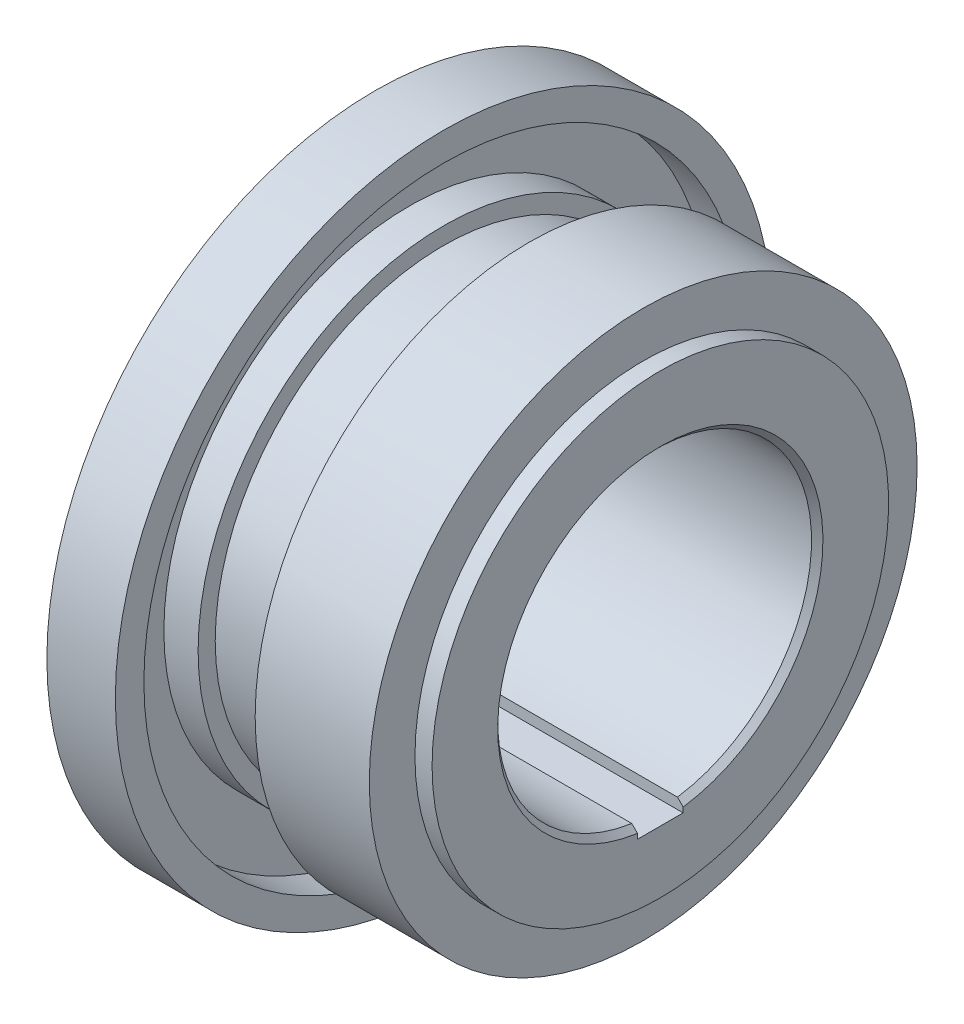
ISO-10303-21;
HEADER;
FILE_DESCRIPTION(('STEP AP214'),'2;1');
FILE_NAME('part.step','',(''),(''),'','','');
FILE_SCHEMA(('AUTOMOTIVE_DESIGN { 1 0 10303 214 1 1 1 1 }'));
ENDSEC;
DATA;
#1=APPLICATION_CONTEXT('core data for automotive mechanical design processes');
#2=APPLICATION_PROTOCOL_DEFINITION('international standard','automotive_design',2000,#1);
#3=PRODUCT_CONTEXT('',#1,'mechanical');
#4=PRODUCT('Part','Part','',(#3));
#5=PRODUCT_RELATED_PRODUCT_CATEGORY('part','',(#4));
#6=PRODUCT_DEFINITION_FORMATION('','',#4);
#7=PRODUCT_DEFINITION_CONTEXT('part definition',#1,'design');
#8=PRODUCT_DEFINITION('design','',#6,#7);
#9=PRODUCT_DEFINITION_SHAPE('','',#8);
#10=(LENGTH_UNIT() NAMED_UNIT(*) SI_UNIT(.MILLI.,.METRE.));
#11=(NAMED_UNIT(*) PLANE_ANGLE_UNIT() SI_UNIT($,.RADIAN.));
#12=(NAMED_UNIT(*) SI_UNIT($,.STERADIAN.) SOLID_ANGLE_UNIT());
#13=UNCERTAINTY_MEASURE_WITH_UNIT(LENGTH_MEASURE(1.E-05),#10,'distance_accuracy_value','');
#14=(GEOMETRIC_REPRESENTATION_CONTEXT(3) GLOBAL_UNCERTAINTY_ASSIGNED_CONTEXT((#13)) GLOBAL_UNIT_ASSIGNED_CONTEXT((#10,
#11,#12)) REPRESENTATION_CONTEXT('',''));
#15=CARTESIAN_POINT('',(0.,0.,0.));
#16=DIRECTION('',(0.,0.,1.));
#17=DIRECTION('',(1.,0.,0.));
#18=AXIS2_PLACEMENT_3D('',#15,#16,#17);
#19=CARTESIAN_POINT('',(0.,0.,0.));
#20=DIRECTION('',(-1.,0.,0.));
#21=DIRECTION('',(0.,0.,1.));
#22=AXIS2_PLACEMENT_3D('',#19,#20,#21);
#23=CYLINDRICAL_SURFACE('',#22,40.);
#24=CARTESIAN_POINT('',(50.,0.,0.));
#25=DIRECTION('',(-1.,0.,0.));
#26=DIRECTION('',(0.,0.,1.));
#27=AXIS2_PLACEMENT_3D('',#24,#25,#26);
#28=CIRCLE('',#27,40.);
#29=CARTESIAN_POINT('',(50.,0.,40.));
#30=VERTEX_POINT('',#29);
#31=EDGE_CURVE('E225',#30,#30,#28,.T.);
#32=ORIENTED_EDGE('',*,*,#31,.T.);
#33=EDGE_LOOP('',(#32));
#34=FACE_BOUND('',#33,.T.);
#35=CARTESIAN_POINT('',(47.,0.,0.));
#36=DIRECTION('',(-1.,0.,0.));
#37=DIRECTION('',(0.,-1.,0.));
#38=AXIS2_PLACEMENT_3D('',#35,#36,#37);
#39=CIRCLE('',#38,40.);
#40=CARTESIAN_POINT('',(47.,-40.,0.));
#41=VERTEX_POINT('',#40);
#42=EDGE_CURVE('E175',#41,#41,#39,.T.);
#43=ORIENTED_EDGE('',*,*,#42,.F.);
#44=EDGE_LOOP('',(#43));
#45=FACE_BOUND('',#44,.T.);
#46=ADVANCED_FACE('F46',(#34,#45),#23,.T.);
#47=CARTESIAN_POINT('',(12.,0.,0.));
#48=DIRECTION('',(-1.,0.,0.));
#49=DIRECTION('',(0.,0.,1.));
#50=AXIS2_PLACEMENT_3D('',#47,#48,#49);
#51=CIRCLE('',#50,40.);
#52=CARTESIAN_POINT('',(12.,0.,40.));
#53=VERTEX_POINT('',#52);
#54=EDGE_CURVE('E221',#53,#53,#51,.T.);
#55=ORIENTED_EDGE('',*,*,#54,.F.);
#56=EDGE_LOOP('',(#55));
#57=FACE_BOUND('',#56,.T.);
#58=CARTESIAN_POINT('',(27.,0.,0.));
#59=DIRECTION('',(1.,0.,0.));
#60=DIRECTION('',(0.,1.,0.));
#61=AXIS2_PLACEMENT_3D('',#58,#59,#60);
#62=CIRCLE('',#61,40.);
#63=CARTESIAN_POINT('',(27.,40.,0.));
#64=VERTEX_POINT('',#63);
#65=EDGE_CURVE('E179',#64,#64,#62,.T.);
#66=ORIENTED_EDGE('',*,*,#65,.F.);
#67=EDGE_LOOP('',(#66));
#68=FACE_BOUND('',#67,.T.);
#69=ADVANCED_FACE('F266',(#57,#68),#23,.T.);
#70=CARTESIAN_POINT('',(0.,0.,0.));
#71=DIRECTION('',(-1.,0.,0.));
#72=DIRECTION('',(0.,0.,1.));
#73=AXIS2_PLACEMENT_3D('',#70,#71,#72);
#74=CYLINDRICAL_SURFACE('',#73,27.5);
#75=CARTESIAN_POINT('',(49.,0.,0.));
#76=DIRECTION('',(-1.,0.,0.));
#77=DIRECTION('',(0.,0.,1.));
#78=AXIS2_PLACEMENT_3D('',#75,#76,#77);
#79=CIRCLE('',#78,27.5);
#80=CARTESIAN_POINT('',(49.,-27.2075357208256,-3.99999999999999));
#81=VERTEX_POINT('',#80);
#82=CARTESIAN_POINT('',(49.,-27.2075357208256,4.00000000000001));
#83=VERTEX_POINT('',#82);
#84=EDGE_CURVE('E193',#81,#83,#79,.F.);
#85=ORIENTED_EDGE('',*,*,#84,.T.);
#86=DIRECTION('',(-1.,0.,0.));
#87=VECTOR('',#86,1.);
#88=CARTESIAN_POINT('',(0.,-27.2075357208256,4.00000000000001));
#89=LINE('',#88,#87);
#90=CARTESIAN_POINT('',(1.00000000000002,-27.2075357208256,4.00000000000001));
#91=VERTEX_POINT('',#90);
#92=EDGE_CURVE('E156',#83,#91,#89,.T.);
#93=ORIENTED_EDGE('',*,*,#92,.T.);
#94=CARTESIAN_POINT('',(1.00000000000002,0.,0.));
#95=DIRECTION('',(1.,0.,0.));
#96=DIRECTION('',(0.,0.,-1.));
#97=AXIS2_PLACEMENT_3D('',#94,#95,#96);
#98=CIRCLE('',#97,27.5);
#99=CARTESIAN_POINT('',(1.00000000000002,-27.2075357208256,-3.99999999999999));
#100=VERTEX_POINT('',#99);
#101=EDGE_CURVE('E189',#91,#100,#98,.F.);
#102=ORIENTED_EDGE('',*,*,#101,.T.);
#103=DIRECTION('',(-1.,0.,0.));
#104=VECTOR('',#103,1.);
#105=CARTESIAN_POINT('',(0.,-27.2075357208256,-3.99999999999999));
#106=LINE('',#105,#104);
#107=EDGE_CURVE('E143',#100,#81,#106,.F.);
#108=ORIENTED_EDGE('',*,*,#107,.T.);
#109=EDGE_LOOP('',(#85,#93,#102,#108));
#110=FACE_BOUND('',#109,.T.);
#111=ADVANCED_FACE('F244',(#110),#74,.F.);
#112=CARTESIAN_POINT('',(0.,27.5,0.));
#113=DIRECTION('',(1.,0.,0.));
#114=DIRECTION('',(0.,0.,-1.));
#115=AXIS2_PLACEMENT_3D('',#112,#113,#114);
#116=PLANE('',#115);
#117=CARTESIAN_POINT('',(0.,0.,0.));
#118=DIRECTION('',(1.,0.,0.));
#119=DIRECTION('',(0.,0.,-1.));
#120=AXIS2_PLACEMENT_3D('',#117,#118,#119);
#121=CIRCLE('',#120,28.5);
#122=CARTESIAN_POINT('',(0.,-28.217902119045,-3.99999999999999));
#123=VERTEX_POINT('',#122);
#124=CARTESIAN_POINT('',(0.,-28.217902119045,4.00000000000001));
#125=VERTEX_POINT('',#124);
#126=EDGE_CURVE('E185',#123,#125,#121,.T.);
#127=ORIENTED_EDGE('',*,*,#126,.T.);
#128=DIRECTION('',(0.,1.,0.));
#129=VECTOR('',#128,1.);
#130=CARTESIAN_POINT('',(0.,-29.1,4.00000000000001));
#131=LINE('',#130,#129);
#132=CARTESIAN_POINT('',(0.,-29.1,4.00000000000001));
#133=VERTEX_POINT('',#132);
#134=EDGE_CURVE('E135',#133,#125,#131,.T.);
#135=ORIENTED_EDGE('',*,*,#134,.F.);
#136=DIRECTION('',(0.,0.,1.));
#137=VECTOR('',#136,1.);
#138=CARTESIAN_POINT('',(0.,-29.1,-3.99999999999999));
#139=LINE('',#138,#137);
#140=CARTESIAN_POINT('',(0.,-29.1,-3.99999999999999));
#141=VERTEX_POINT('',#140);
#142=EDGE_CURVE('E132',#141,#133,#139,.T.);
#143=ORIENTED_EDGE('',*,*,#142,.F.);
#144=DIRECTION('',(0.,-1.,0.));
#145=VECTOR('',#144,1.);
#146=CARTESIAN_POINT('',(0.,-29.1,-3.99999999999999));
#147=LINE('',#146,#145);
#148=EDGE_CURVE('E108',#123,#141,#147,.T.);
#149=ORIENTED_EDGE('',*,*,#148,.F.);
#150=EDGE_LOOP('',(#127,#135,#143,#149));
#151=FACE_BOUND('',#150,.T.);
#152=CARTESIAN_POINT('',(0.,0.,0.));
#153=DIRECTION('',(-1.,0.,0.));
#154=DIRECTION('',(0.,0.,1.));
#155=AXIS2_PLACEMENT_3D('',#152,#153,#154);
#156=CIRCLE('',#155,57.5);
#157=CARTESIAN_POINT('',(0.,0.,57.5));
#158=VERTEX_POINT('',#157);
#159=EDGE_CURVE('E197',#158,#158,#156,.T.);
#160=ORIENTED_EDGE('',*,*,#159,.T.);
#161=EDGE_LOOP('',(#160));
#162=FACE_BOUND('',#161,.T.);
#163=ADVANCED_FACE('F251',(#151,#162),#116,.F.);
#164=CARTESIAN_POINT('',(0.,0.,0.));
#165=DIRECTION('',(-1.,0.,0.));
#166=DIRECTION('',(0.,0.,1.));
#167=AXIS2_PLACEMENT_3D('',#164,#165,#166);
#168=CYLINDRICAL_SURFACE('',#167,57.5);
#169=ORIENTED_EDGE('',*,*,#159,.F.);
#170=EDGE_LOOP('',(#169));
#171=FACE_BOUND('',#170,.T.);
#172=CARTESIAN_POINT('',(12.,0.,0.));
#173=DIRECTION('',(-1.,0.,0.));
#174=DIRECTION('',(0.,0.,1.));
#175=AXIS2_PLACEMENT_3D('',#172,#173,#174);
#176=CIRCLE('',#175,57.5);
#177=CARTESIAN_POINT('',(12.,0.,57.5));
#178=VERTEX_POINT('',#177);
#179=EDGE_CURVE('E201',#178,#178,#176,.T.);
#180=ORIENTED_EDGE('',*,*,#179,.T.);
#181=EDGE_LOOP('',(#180));
#182=FACE_BOUND('',#181,.T.);
#183=ADVANCED_FACE('F295',(#171,#182),#168,.T.);
#184=CARTESIAN_POINT('',(12.,57.5,0.));
#185=DIRECTION('',(-1.,0.,0.));
#186=DIRECTION('',(0.,0.,1.));
#187=AXIS2_PLACEMENT_3D('',#184,#185,#186);
#188=PLANE('',#187);
#189=ORIENTED_EDGE('',*,*,#179,.F.);
#190=EDGE_LOOP('',(#189));
#191=FACE_BOUND('',#190,.T.);
#192=CARTESIAN_POINT('',(12.,0.,0.));
#193=DIRECTION('',(-1.,0.,0.));
#194=DIRECTION('',(0.,0.,1.));
#195=AXIS2_PLACEMENT_3D('',#192,#193,#194);
#196=CIRCLE('',#195,52.5);
#197=CARTESIAN_POINT('',(12.,0.,52.5));
#198=VERTEX_POINT('',#197);
#199=EDGE_CURVE('E205',#198,#198,#196,.T.);
#200=ORIENTED_EDGE('',*,*,#199,.T.);
#201=EDGE_LOOP('',(#200));
#202=FACE_BOUND('',#201,.T.);
#203=ADVANCED_FACE('F291',(#191,#202),#188,.F.);
#204=CARTESIAN_POINT('',(0.,0.,0.));
#205=DIRECTION('',(-1.,0.,0.));
#206=DIRECTION('',(0.,0.,1.));
#207=AXIS2_PLACEMENT_3D('',#204,#205,#206);
#208=CYLINDRICAL_SURFACE('',#207,52.5);
#209=ORIENTED_EDGE('',*,*,#199,.F.);
#210=EDGE_LOOP('',(#209));
#211=FACE_BOUND('',#210,.T.);
#212=CARTESIAN_POINT('',(6.,0.,0.));
#213=DIRECTION('',(-1.,0.,0.));
#214=DIRECTION('',(0.,0.,1.));
#215=AXIS2_PLACEMENT_3D('',#212,#213,#214);
#216=CIRCLE('',#215,52.5);
#217=CARTESIAN_POINT('',(6.,0.,52.5));
#218=VERTEX_POINT('',#217);
#219=EDGE_CURVE('E209',#218,#218,#216,.T.);
#220=ORIENTED_EDGE('',*,*,#219,.T.);
#221=EDGE_LOOP('',(#220));
#222=FACE_BOUND('',#221,.T.);
#223=ADVANCED_FACE('F287',(#211,#222),#208,.F.);
#224=CARTESIAN_POINT('',(6.,52.5,0.));
#225=DIRECTION('',(-1.,0.,0.));
#226=DIRECTION('',(0.,0.,1.));
#227=AXIS2_PLACEMENT_3D('',#224,#225,#226);
#228=PLANE('',#227);
#229=ORIENTED_EDGE('',*,*,#219,.F.);
#230=EDGE_LOOP('',(#229));
#231=FACE_BOUND('',#230,.T.);
#232=CARTESIAN_POINT('',(6.,0.,0.));
#233=DIRECTION('',(-1.,0.,0.));
#234=DIRECTION('',(0.,0.,1.));
#235=AXIS2_PLACEMENT_3D('',#232,#233,#234);
#236=CIRCLE('',#235,43.);
#237=CARTESIAN_POINT('',(6.,0.,43.));
#238=VERTEX_POINT('',#237);
#239=EDGE_CURVE('E213',#238,#238,#236,.T.);
#240=ORIENTED_EDGE('',*,*,#239,.T.);
#241=EDGE_LOOP('',(#240));
#242=FACE_BOUND('',#241,.T.);
#243=ADVANCED_FACE('F283',(#231,#242),#228,.F.);
#244=CARTESIAN_POINT('',(0.,0.,0.));
#245=DIRECTION('',(-1.,0.,0.));
#246=DIRECTION('',(0.,0.,1.));
#247=AXIS2_PLACEMENT_3D('',#244,#245,#246);
#248=CYLINDRICAL_SURFACE('',#247,43.);
#249=ORIENTED_EDGE('',*,*,#239,.F.);
#250=EDGE_LOOP('',(#249));
#251=FACE_BOUND('',#250,.T.);
#252=CARTESIAN_POINT('',(12.,0.,0.));
#253=DIRECTION('',(-1.,0.,0.));
#254=DIRECTION('',(0.,0.,1.));
#255=AXIS2_PLACEMENT_3D('',#252,#253,#254);
#256=CIRCLE('',#255,43.);
#257=CARTESIAN_POINT('',(12.,0.,43.));
#258=VERTEX_POINT('',#257);
#259=EDGE_CURVE('E217',#258,#258,#256,.T.);
#260=ORIENTED_EDGE('',*,*,#259,.T.);
#261=EDGE_LOOP('',(#260));
#262=FACE_BOUND('',#261,.T.);
#263=ADVANCED_FACE('F279',(#251,#262),#248,.T.);
#264=CARTESIAN_POINT('',(12.,43.,0.));
#265=DIRECTION('',(-1.,0.,0.));
#266=DIRECTION('',(0.,0.,1.));
#267=AXIS2_PLACEMENT_3D('',#264,#265,#266);
#268=PLANE('',#267);
#269=ORIENTED_EDGE('',*,*,#259,.F.);
#270=EDGE_LOOP('',(#269));
#271=FACE_BOUND('',#270,.T.);
#272=ORIENTED_EDGE('',*,*,#54,.T.);
#273=EDGE_LOOP('',(#272));
#274=FACE_BOUND('',#273,.T.);
#275=ADVANCED_FACE('F277',(#271,#274),#268,.F.);
#276=CARTESIAN_POINT('',(50.,40.,0.));
#277=DIRECTION('',(-1.,0.,0.));
#278=DIRECTION('',(0.,0.,1.));
#279=AXIS2_PLACEMENT_3D('',#276,#277,#278);
#280=PLANE('',#279);
#281=DIRECTION('',(0.,0.,1.));
#282=VECTOR('',#281,1.);
#283=CARTESIAN_POINT('',(50.,-29.1,-3.99999999999999));
#284=LINE('',#283,#282);
#285=CARTESIAN_POINT('',(50.,-29.1,-3.99999999999999));
#286=VERTEX_POINT('',#285);
#287=CARTESIAN_POINT('',(50.,-29.1,4.00000000000001));
#288=VERTEX_POINT('',#287);
#289=EDGE_CURVE('E114',#286,#288,#284,.T.);
#290=ORIENTED_EDGE('',*,*,#289,.T.);
#291=DIRECTION('',(0.,1.,0.));
#292=VECTOR('',#291,1.);
#293=CARTESIAN_POINT('',(50.,-29.1,4.00000000000001));
#294=LINE('',#293,#292);
#295=CARTESIAN_POINT('',(50.,-28.2179021190449,4.00000000000001));
#296=VERTEX_POINT('',#295);
#297=EDGE_CURVE('E129',#288,#296,#294,.T.);
#298=ORIENTED_EDGE('',*,*,#297,.T.);
#299=CARTESIAN_POINT('',(50.,0.,0.));
#300=DIRECTION('',(-1.,0.,0.));
#301=DIRECTION('',(0.,0.,1.));
#302=AXIS2_PLACEMENT_3D('',#299,#300,#301);
#303=CIRCLE('',#302,28.5);
#304=CARTESIAN_POINT('',(50.,-28.2179021190449,-3.99999999999999));
#305=VERTEX_POINT('',#304);
#306=EDGE_CURVE('E127',#296,#305,#303,.T.);
#307=ORIENTED_EDGE('',*,*,#306,.T.);
#308=DIRECTION('',(0.,-1.,0.));
#309=VECTOR('',#308,1.);
#310=CARTESIAN_POINT('',(50.,-29.1,-3.99999999999999));
#311=LINE('',#310,#309);
#312=EDGE_CURVE('E69',#305,#286,#311,.T.);
#313=ORIENTED_EDGE('',*,*,#312,.T.);
#314=EDGE_LOOP('',(#290,#298,#307,#313));
#315=FACE_BOUND('',#314,.T.);
#316=ORIENTED_EDGE('',*,*,#31,.F.);
#317=EDGE_LOOP('',(#316));
#318=FACE_BOUND('',#317,.T.);
#319=ADVANCED_FACE('F124',(#315,#318),#280,.F.);
#320=CARTESIAN_POINT('',(1.00000000000002,0.,0.));
#321=DIRECTION('',(-1.,0.,0.));
#322=DIRECTION('',(0.,0.,1.));
#323=AXIS2_PLACEMENT_3D('',#320,#321,#322);
#324=CONICAL_SURFACE('',#323,27.5,0.785398163397457);
#325=CARTESIAN_POINT('',(-6.4657867289815,-34.7362381609844,4.00000000000001));
#326=CARTESIAN_POINT('',(-5.30225524245978,-33.5649578308254,4.00000000000001));
#327=CARTESIAN_POINT('',(-4.13905514690985,-32.3933473782209,4.00000000000001));
#328=CARTESIAN_POINT('',(-1.81373671527284,-30.0490581110084,4.00000000000001));
#329=CARTESIAN_POINT('',(-0.651618377088867,-28.8763792984801,4.00000000000001));
#330=CARTESIAN_POINT('',(1.09043781866773,-27.1162494525712,4.00000000000001));
#331=CARTESIAN_POINT('',(1.67093675574803,-26.5293538035112,4.00000000000001));
#332=CARTESIAN_POINT('',(2.83147189345397,-25.3551053112892,4.00000000000001));
#333=CARTESIAN_POINT('',(3.41150809414695,-24.7677524681937,4.00000000000001));
#334=CARTESIAN_POINT('',(4.57101670360363,-23.5924881775943,4.00000000000001));
#335=CARTESIAN_POINT('',(5.15048911127732,-23.0045767290147,4.00000000000001));
#336=CARTESIAN_POINT('',(6.30871538340369,-21.8280459386062,4.00000000000001));
#337=CARTESIAN_POINT('',(6.88746924748986,-21.2394265964165,4.00000000000001));
#338=CARTESIAN_POINT('',(7.46578672898152,-20.6503783967918,4.00000000000001));
#339=B_SPLINE_CURVE_WITH_KNOTS('',3,(#325,#326,#327,#328,#329,#330,#331,#332,#333,#334,#335,
#336,#337,#338),.UNSPECIFIED.,.F.,.F.,(4,2,2,2,2,2,4),(0.,4.95291207297134,9.9058145250251,
12.3822693700354,14.8587238546172,17.3351831175365,19.8116436430903),.UNSPECIFIED.);
#340=EDGE_CURVE('E77',#125,#91,#339,.T.);
#341=ORIENTED_EDGE('',*,*,#340,.F.);
#342=ORIENTED_EDGE('',*,*,#126,.F.);
#343=CARTESIAN_POINT('',(7.46578672898153,-20.6503783967918,-3.99999999999999));
#344=CARTESIAN_POINT('',(6.88746924748986,-21.2394265964165,-3.99999999999999));
#345=CARTESIAN_POINT('',(6.30871538340369,-21.8280459386062,-3.99999999999999));
#346=CARTESIAN_POINT('',(5.15048911127732,-23.0045767290147,-3.99999999999999));
#347=CARTESIAN_POINT('',(4.57101670360363,-23.5924881775943,-3.99999999999999));
#348=CARTESIAN_POINT('',(3.41150809414696,-24.7677524681937,-3.99999999999999));
#349=CARTESIAN_POINT('',(2.83147189345397,-25.3551053112892,-3.99999999999999));
#350=CARTESIAN_POINT('',(1.67093675574803,-26.5293538035112,-3.99999999999999));
#351=CARTESIAN_POINT('',(1.09043781866774,-27.1162494525712,-3.99999999999999));
#352=CARTESIAN_POINT('',(-0.651618377088863,-28.8763792984801,-3.99999999999999));
#353=CARTESIAN_POINT('',(-1.81373671527284,-30.0490581110084,-3.99999999999999));
#354=CARTESIAN_POINT('',(-4.13905514690984,-32.3933473782209,-3.99999999999999));
#355=CARTESIAN_POINT('',(-5.30225524245978,-33.5649578308254,-3.99999999999999));
#356=CARTESIAN_POINT('',(-6.4657867289815,-34.7362381609844,-3.99999999999999));
#357=B_SPLINE_CURVE_WITH_KNOTS('',3,(#343,#344,#345,#346,#347,#348,#349,#350,#351,#352,#353,
#354,#355,#356),.UNSPECIFIED.,.F.,.F.,(4,2,2,2,2,2,4),(0.,2.47646052555381,4.95291978847308,
7.42937427305486,9.90582911806518,14.8587315701189,19.8116436430903),.UNSPECIFIED.);
#358=EDGE_CURVE('E148',#100,#123,#357,.T.);
#359=ORIENTED_EDGE('',*,*,#358,.F.);
#360=ORIENTED_EDGE('',*,*,#101,.F.);
#361=EDGE_LOOP('',(#341,#342,#359,#360));
#362=FACE_BOUND('',#361,.T.);
#363=ADVANCED_FACE('F159',(#362),#324,.F.);
#364=CARTESIAN_POINT('',(50.,0.,0.));
#365=DIRECTION('',(1.,0.,0.));
#366=DIRECTION('',(0.,0.,-1.));
#367=AXIS2_PLACEMENT_3D('',#364,#365,#366);
#368=CONICAL_SURFACE('',#367,28.5,0.785398163397447);
#369=CARTESIAN_POINT('',(42.5342132710185,-20.650378396792,4.00000000000001));
#370=CARTESIAN_POINT('',(43.1125307525102,-21.2394265964166,4.00000000000001));
#371=CARTESIAN_POINT('',(43.6912846165963,-21.8280459386063,4.00000000000001));
#372=CARTESIAN_POINT('',(44.8495108887227,-23.0045767290148,4.00000000000001));
#373=CARTESIAN_POINT('',(45.4289832963964,-23.5924881775944,4.00000000000001));
#374=CARTESIAN_POINT('',(46.5884919058531,-24.7677524681938,4.00000000000001));
#375=CARTESIAN_POINT('',(47.168528106546,-25.3551053112892,4.00000000000001));
#376=CARTESIAN_POINT('',(48.329063244252,-26.5293538035112,4.00000000000001));
#377=CARTESIAN_POINT('',(48.9095621813323,-27.1162494525712,4.00000000000001));
#378=CARTESIAN_POINT('',(50.6516183770889,-28.87637929848,4.00000000000001));
#379=CARTESIAN_POINT('',(51.8137367152728,-30.0490581110083,4.00000000000001));
#380=CARTESIAN_POINT('',(54.1390551469098,-32.3933473782207,4.00000000000001));
#381=CARTESIAN_POINT('',(55.3022552424598,-33.5649578308252,4.00000000000001));
#382=CARTESIAN_POINT('',(56.4657867289815,-34.7362381609842,4.00000000000001));
#383=B_SPLINE_CURVE_WITH_KNOTS('',3,(#369,#370,#371,#372,#373,#374,#375,#376,#377,#378,#379,
#380,#381,#382),.UNSPECIFIED.,.F.,.F.,(4,2,2,2,2,2,4),(0.,2.47646052555377,4.95291978847301,
7.42937427305474,9.90582911806504,14.8587315701187,19.81164364309),.UNSPECIFIED.);
#384=EDGE_CURVE('E11',#83,#296,#383,.T.);
#385=ORIENTED_EDGE('',*,*,#384,.F.);
#386=ORIENTED_EDGE('',*,*,#84,.F.);
#387=CARTESIAN_POINT('',(56.4657867289815,-34.7362381609842,-3.99999999999999));
#388=CARTESIAN_POINT('',(55.3022552424598,-33.5649578308252,-3.99999999999999));
#389=CARTESIAN_POINT('',(54.1390551469098,-32.3933473782207,-3.99999999999999));
#390=CARTESIAN_POINT('',(51.8137367152728,-30.0490581110083,-3.99999999999999));
#391=CARTESIAN_POINT('',(50.6516183770889,-28.87637929848,-3.99999999999999));
#392=CARTESIAN_POINT('',(48.9095621813323,-27.1162494525713,-3.99999999999999));
#393=CARTESIAN_POINT('',(48.329063244252,-26.5293538035112,-3.99999999999999));
#394=CARTESIAN_POINT('',(47.1685281065461,-25.3551053112892,-3.99999999999999));
#395=CARTESIAN_POINT('',(46.5884919058531,-24.7677524681938,-3.99999999999999));
#396=CARTESIAN_POINT('',(45.4289832963964,-23.5924881775944,-3.99999999999999));
#397=CARTESIAN_POINT('',(44.8495108887227,-23.0045767290148,-3.99999999999999));
#398=CARTESIAN_POINT('',(43.6912846165963,-21.8280459386063,-3.99999999999999));
#399=CARTESIAN_POINT('',(43.1125307525102,-21.2394265964166,-3.99999999999999));
#400=CARTESIAN_POINT('',(42.5342132710185,-20.650378396792,-3.99999999999999));
#401=B_SPLINE_CURVE_WITH_KNOTS('',3,(#387,#388,#389,#390,#391,#392,#393,#394,#395,#396,#397,
#398,#399,#400),.UNSPECIFIED.,.F.,.F.,(4,2,2,2,2,2,4),(0.,4.95291207297127,9.90581452502495,
12.3822693700352,14.858723854617,17.3351831175362,19.81164364309),.UNSPECIFIED.);
#402=EDGE_CURVE('E62',#305,#81,#401,.T.);
#403=ORIENTED_EDGE('',*,*,#402,.F.);
#404=ORIENTED_EDGE('',*,*,#306,.F.);
#405=EDGE_LOOP('',(#385,#386,#403,#404));
#406=FACE_BOUND('',#405,.T.);
#407=ADVANCED_FACE('F49',(#406),#368,.F.);
#408=CARTESIAN_POINT('',(47.,39.9883073467828,0.));
#409=DIRECTION('',(-1.,0.,0.));
#410=DIRECTION('',(0.,-1.,0.));
#411=AXIS2_PLACEMENT_3D('',#408,#409,#410);
#412=PLANE('',#411);
#413=ORIENTED_EDGE('',*,*,#42,.T.);
#414=EDGE_LOOP('',(#413));
#415=FACE_BOUND('',#414,.T.);
#416=CARTESIAN_POINT('',(47.,0.,0.));
#417=DIRECTION('',(-1.,0.,0.));
#418=DIRECTION('',(0.,-1.,0.));
#419=AXIS2_PLACEMENT_3D('',#416,#417,#418);
#420=CIRCLE('',#419,48.);
#421=CARTESIAN_POINT('',(47.,-48.,0.));
#422=VERTEX_POINT('',#421);
#423=EDGE_CURVE('E233',#422,#422,#420,.T.);
#424=ORIENTED_EDGE('',*,*,#423,.F.);
#425=EDGE_LOOP('',(#424));
#426=FACE_BOUND('',#425,.T.);
#427=ADVANCED_FACE('F256',(#415,#426),#412,.F.);
#428=CARTESIAN_POINT('',(27.,39.9883073467828,0.));
#429=DIRECTION('',(1.,0.,0.));
#430=DIRECTION('',(0.,1.,0.));
#431=AXIS2_PLACEMENT_3D('',#428,#429,#430);
#432=PLANE('',#431);
#433=ORIENTED_EDGE('',*,*,#65,.T.);
#434=EDGE_LOOP('',(#433));
#435=FACE_BOUND('',#434,.T.);
#436=CARTESIAN_POINT('',(27.,0.,0.));
#437=DIRECTION('',(-1.,0.,0.));
#438=DIRECTION('',(0.,-1.,0.));
#439=AXIS2_PLACEMENT_3D('',#436,#437,#438);
#440=CIRCLE('',#439,48.);
#441=CARTESIAN_POINT('',(27.,-48.,0.));
#442=VERTEX_POINT('',#441);
#443=EDGE_CURVE('E229',#442,#442,#440,.T.);
#444=ORIENTED_EDGE('',*,*,#443,.T.);
#445=EDGE_LOOP('',(#444));
#446=FACE_BOUND('',#445,.T.);
#447=ADVANCED_FACE('F262',(#435,#446),#432,.F.);
#448=CARTESIAN_POINT('',(27.,0.,0.));
#449=DIRECTION('',(-1.,0.,0.));
#450=DIRECTION('',(0.,-1.,0.));
#451=AXIS2_PLACEMENT_3D('',#448,#449,#450);
#452=CYLINDRICAL_SURFACE('',#451,48.);
#453=ORIENTED_EDGE('',*,*,#443,.F.);
#454=EDGE_LOOP('',(#453));
#455=FACE_BOUND('',#454,.T.);
#456=ORIENTED_EDGE('',*,*,#423,.T.);
#457=EDGE_LOOP('',(#456));
#458=FACE_BOUND('',#457,.T.);
#459=ADVANCED_FACE('F309',(#455,#458),#452,.T.);
#460=CARTESIAN_POINT('',(50.,-29.1,4.00000000000001));
#461=DIRECTION('',(0.,0.,1.));
#462=DIRECTION('',(1.,0.,0.));
#463=AXIS2_PLACEMENT_3D('',#460,#461,#462);
#464=PLANE('',#463);
#465=ORIENTED_EDGE('',*,*,#340,.T.);
#466=ORIENTED_EDGE('',*,*,#92,.F.);
#467=ORIENTED_EDGE('',*,*,#384,.T.);
#468=ORIENTED_EDGE('',*,*,#297,.F.);
#469=DIRECTION('',(-1.,0.,0.));
#470=VECTOR('',#469,1.);
#471=CARTESIAN_POINT('',(50.,-29.1,4.00000000000001));
#472=LINE('',#471,#470);
#473=EDGE_CURVE('E113',#288,#133,#472,.T.);
#474=ORIENTED_EDGE('',*,*,#473,.T.);
#475=ORIENTED_EDGE('',*,*,#134,.T.);
#476=EDGE_LOOP('',(#465,#466,#467,#468,#474,#475));
#477=FACE_BOUND('',#476,.T.);
#478=ADVANCED_FACE('F165',(#477),#464,.F.);
#479=CARTESIAN_POINT('',(50.,-29.1,-3.99999999999999));
#480=DIRECTION('',(0.,-1.,0.));
#481=DIRECTION('',(0.,0.,-1.));
#482=AXIS2_PLACEMENT_3D('',#479,#480,#481);
#483=PLANE('',#482);
#484=ORIENTED_EDGE('',*,*,#142,.T.);
#485=ORIENTED_EDGE('',*,*,#473,.F.);
#486=ORIENTED_EDGE('',*,*,#289,.F.);
#487=DIRECTION('',(-1.,0.,0.));
#488=VECTOR('',#487,1.);
#489=CARTESIAN_POINT('',(50.,-29.1,-3.99999999999999));
#490=LINE('',#489,#488);
#491=EDGE_CURVE('E104',#286,#141,#490,.T.);
#492=ORIENTED_EDGE('',*,*,#491,.T.);
#493=EDGE_LOOP('',(#484,#485,#486,#492));
#494=FACE_BOUND('',#493,.T.);
#495=ADVANCED_FACE('F117',(#494),#483,.F.);
#496=CARTESIAN_POINT('',(50.,-29.1,-3.99999999999999));
#497=DIRECTION('',(0.,0.,-1.));
#498=DIRECTION('',(-1.,0.,0.));
#499=AXIS2_PLACEMENT_3D('',#496,#497,#498);
#500=PLANE('',#499);
#501=ORIENTED_EDGE('',*,*,#358,.T.);
#502=ORIENTED_EDGE('',*,*,#148,.T.);
#503=ORIENTED_EDGE('',*,*,#491,.F.);
#504=ORIENTED_EDGE('',*,*,#312,.F.);
#505=ORIENTED_EDGE('',*,*,#402,.T.);
#506=ORIENTED_EDGE('',*,*,#107,.F.);
#507=EDGE_LOOP('',(#501,#502,#503,#504,#505,#506));
#508=FACE_BOUND('',#507,.T.);
#509=ADVANCED_FACE('F106',(#508),#500,.F.);
#510=CLOSED_SHELL('',(#46,#69,#111,#163,#183,#203,#223,#243,#263,#275,#319,#363,#407,#427,#447,
#459,#478,#495,#509));
#511=MANIFOLD_SOLID_BREP('B2',#510);
#512=ADVANCED_BREP_SHAPE_REPRESENTATION('',(#18,#511),#14);
#513=SHAPE_DEFINITION_REPRESENTATION(#9,#512);
ENDSEC;
END-ISO-10303-21;
